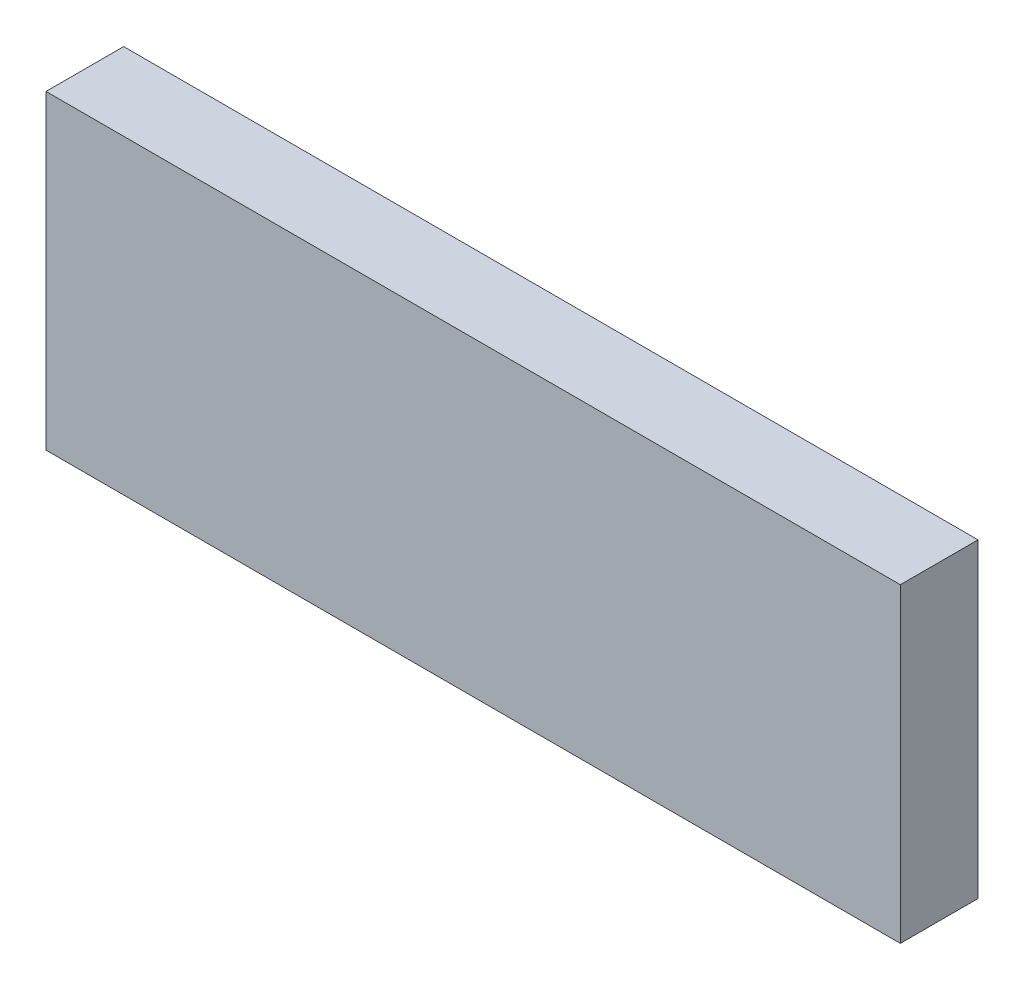
ISO-10303-21;
HEADER;
FILE_DESCRIPTION(('STEP AP214'),'2;1');
FILE_NAME('part.step','',(''),(''),'','','');
FILE_SCHEMA(('AUTOMOTIVE_DESIGN { 1 0 10303 214 1 1 1 1 }'));
ENDSEC;
DATA;
#1=APPLICATION_CONTEXT('core data for automotive mechanical design processes');
#2=APPLICATION_PROTOCOL_DEFINITION('international standard','automotive_design',2000,#1);
#3=PRODUCT_CONTEXT('',#1,'mechanical');
#4=PRODUCT('Part','Part','',(#3));
#5=PRODUCT_RELATED_PRODUCT_CATEGORY('part','',(#4));
#6=PRODUCT_DEFINITION_FORMATION('','',#4);
#7=PRODUCT_DEFINITION_CONTEXT('part definition',#1,'design');
#8=PRODUCT_DEFINITION('design','',#6,#7);
#9=PRODUCT_DEFINITION_SHAPE('','',#8);
#10=(LENGTH_UNIT() NAMED_UNIT(*) SI_UNIT(.MILLI.,.METRE.));
#11=(NAMED_UNIT(*) PLANE_ANGLE_UNIT() SI_UNIT($,.RADIAN.));
#12=(NAMED_UNIT(*) SI_UNIT($,.STERADIAN.) SOLID_ANGLE_UNIT());
#13=UNCERTAINTY_MEASURE_WITH_UNIT(LENGTH_MEASURE(1.E-05),#10,'distance_accuracy_value','');
#14=(GEOMETRIC_REPRESENTATION_CONTEXT(3) GLOBAL_UNCERTAINTY_ASSIGNED_CONTEXT((#13)) GLOBAL_UNIT_ASSIGNED_CONTEXT((#10,
#11,#12)) REPRESENTATION_CONTEXT('',''));
#15=CARTESIAN_POINT('',(0.,0.,0.));
#16=DIRECTION('',(0.,0.,1.));
#17=DIRECTION('',(1.,0.,0.));
#18=AXIS2_PLACEMENT_3D('',#15,#16,#17);
#19=CARTESIAN_POINT('',(-46.0306474820144,34.925,6.35));
#20=DIRECTION('',(1.,0.,0.));
#21=DIRECTION('',(0.,1.,0.));
#22=AXIS2_PLACEMENT_3D('',#19,#20,#21);
#23=PLANE('',#22);
#24=DIRECTION('',(0.,-1.,0.));
#25=VECTOR('',#24,1.);
#26=CARTESIAN_POINT('',(-46.0306474820144,34.925,0.));
#27=LINE('',#26,#25);
#28=CARTESIAN_POINT('',(-46.0306474820144,34.925,0.));
#29=VERTEX_POINT('',#28);
#30=CARTESIAN_POINT('',(-46.0306474820144,9.525,0.));
#31=VERTEX_POINT('',#30);
#32=EDGE_CURVE('E96',#29,#31,#27,.T.);
#33=ORIENTED_EDGE('',*,*,#32,.T.);
#34=DIRECTION('',(0.,0.,-1.));
#35=VECTOR('',#34,1.);
#36=CARTESIAN_POINT('',(-46.0306474820144,9.525,6.35));
#37=LINE('',#36,#35);
#38=CARTESIAN_POINT('',(-46.0306474820144,9.525,6.35));
#39=VERTEX_POINT('',#38);
#40=EDGE_CURVE('E11',#39,#31,#37,.T.);
#41=ORIENTED_EDGE('',*,*,#40,.F.);
#42=DIRECTION('',(0.,-1.,0.));
#43=VECTOR('',#42,1.);
#44=CARTESIAN_POINT('',(-46.0306474820144,34.925,6.35));
#45=LINE('',#44,#43);
#46=CARTESIAN_POINT('',(-46.0306474820144,34.925,6.35));
#47=VERTEX_POINT('',#46);
#48=EDGE_CURVE('E84',#47,#39,#45,.T.);
#49=ORIENTED_EDGE('',*,*,#48,.F.);
#50=DIRECTION('',(0.,0.,-1.));
#51=VECTOR('',#50,1.);
#52=CARTESIAN_POINT('',(-46.0306474820144,34.925,6.35));
#53=LINE('',#52,#51);
#54=EDGE_CURVE('E92',#47,#29,#53,.T.);
#55=ORIENTED_EDGE('',*,*,#54,.T.);
#56=EDGE_LOOP('',(#33,#41,#49,#55));
#57=FACE_BOUND('',#56,.T.);
#58=ADVANCED_FACE('F33',(#57),#23,.F.);
#59=CARTESIAN_POINT('',(-46.0306474820144,9.525,6.35));
#60=DIRECTION('',(0.,1.,0.));
#61=DIRECTION('',(0.,0.,1.));
#62=AXIS2_PLACEMENT_3D('',#59,#60,#61);
#63=PLANE('',#62);
#64=DIRECTION('',(1.,0.,0.));
#65=VECTOR('',#64,1.);
#66=CARTESIAN_POINT('',(-46.0306474820144,9.525,0.));
#67=LINE('',#66,#65);
#68=CARTESIAN_POINT('',(23.8193525179856,9.525,0.));
#69=VERTEX_POINT('',#68);
#70=EDGE_CURVE('E88',#31,#69,#67,.T.);
#71=ORIENTED_EDGE('',*,*,#70,.T.);
#72=DIRECTION('',(0.,0.,-1.));
#73=VECTOR('',#72,1.);
#74=CARTESIAN_POINT('',(23.8193525179856,9.525,6.35));
#75=LINE('',#74,#73);
#76=CARTESIAN_POINT('',(23.8193525179856,9.525,6.35));
#77=VERTEX_POINT('',#76);
#78=EDGE_CURVE('E41',#77,#69,#75,.T.);
#79=ORIENTED_EDGE('',*,*,#78,.F.);
#80=DIRECTION('',(1.,0.,0.));
#81=VECTOR('',#80,1.);
#82=CARTESIAN_POINT('',(-46.0306474820144,9.525,6.35));
#83=LINE('',#82,#81);
#84=EDGE_CURVE('E79',#39,#77,#83,.T.);
#85=ORIENTED_EDGE('',*,*,#84,.F.);
#86=ORIENTED_EDGE('',*,*,#40,.T.);
#87=EDGE_LOOP('',(#71,#79,#85,#86));
#88=FACE_BOUND('',#87,.T.);
#89=ADVANCED_FACE('F87',(#88),#63,.F.);
#90=CARTESIAN_POINT('',(23.8193525179856,34.925,6.35));
#91=DIRECTION('',(-1.,0.,0.));
#92=DIRECTION('',(0.,0.,1.));
#93=AXIS2_PLACEMENT_3D('',#90,#91,#92);
#94=PLANE('',#93);
#95=DIRECTION('',(0.,1.,0.));
#96=VECTOR('',#95,1.);
#97=CARTESIAN_POINT('',(23.8193525179856,34.925,0.));
#98=LINE('',#97,#96);
#99=CARTESIAN_POINT('',(23.8193525179856,34.925,0.));
#100=VERTEX_POINT('',#99);
#101=EDGE_CURVE('E66',#69,#100,#98,.T.);
#102=ORIENTED_EDGE('',*,*,#101,.T.);
#103=DIRECTION('',(0.,0.,-1.));
#104=VECTOR('',#103,1.);
#105=CARTESIAN_POINT('',(23.8193525179856,34.925,6.35));
#106=LINE('',#105,#104);
#107=CARTESIAN_POINT('',(23.8193525179856,34.925,6.35));
#108=VERTEX_POINT('',#107);
#109=EDGE_CURVE('E89',#108,#100,#106,.T.);
#110=ORIENTED_EDGE('',*,*,#109,.F.);
#111=DIRECTION('',(0.,1.,0.));
#112=VECTOR('',#111,1.);
#113=CARTESIAN_POINT('',(23.8193525179856,34.925,6.35));
#114=LINE('',#113,#112);
#115=EDGE_CURVE('E82',#77,#108,#114,.T.);
#116=ORIENTED_EDGE('',*,*,#115,.F.);
#117=ORIENTED_EDGE('',*,*,#78,.T.);
#118=EDGE_LOOP('',(#102,#110,#116,#117));
#119=FACE_BOUND('',#118,.T.);
#120=ADVANCED_FACE('F90',(#119),#94,.F.);
#121=CARTESIAN_POINT('',(-46.0306474820144,34.925,6.35));
#122=DIRECTION('',(0.,-1.,0.));
#123=DIRECTION('',(0.,0.,-1.));
#124=AXIS2_PLACEMENT_3D('',#121,#122,#123);
#125=PLANE('',#124);
#126=DIRECTION('',(-1.,0.,0.));
#127=VECTOR('',#126,1.);
#128=CARTESIAN_POINT('',(-46.0306474820144,34.925,0.));
#129=LINE('',#128,#127);
#130=EDGE_CURVE('E72',#100,#29,#129,.T.);
#131=ORIENTED_EDGE('',*,*,#130,.T.);
#132=ORIENTED_EDGE('',*,*,#54,.F.);
#133=DIRECTION('',(-1.,0.,0.));
#134=VECTOR('',#133,1.);
#135=CARTESIAN_POINT('',(-46.0306474820144,34.925,6.35));
#136=LINE('',#135,#134);
#137=EDGE_CURVE('E49',#108,#47,#136,.T.);
#138=ORIENTED_EDGE('',*,*,#137,.F.);
#139=ORIENTED_EDGE('',*,*,#109,.T.);
#140=EDGE_LOOP('',(#131,#132,#138,#139));
#141=FACE_BOUND('',#140,.T.);
#142=ADVANCED_FACE('F103',(#141),#125,.F.);
#143=CARTESIAN_POINT('',(0.,0.,6.35));
#144=DIRECTION('',(0.,0.,1.));
#145=DIRECTION('',(1.,0.,0.));
#146=AXIS2_PLACEMENT_3D('',#143,#144,#145);
#147=PLANE('',#146);
#148=ORIENTED_EDGE('',*,*,#48,.T.);
#149=ORIENTED_EDGE('',*,*,#84,.T.);
#150=ORIENTED_EDGE('',*,*,#115,.T.);
#151=ORIENTED_EDGE('',*,*,#137,.T.);
#152=EDGE_LOOP('',(#148,#149,#150,#151));
#153=FACE_BOUND('',#152,.T.);
#154=ADVANCED_FACE('F80',(#153),#147,.T.);
#155=CARTESIAN_POINT('',(0.,0.,0.));
#156=DIRECTION('',(0.,0.,1.));
#157=DIRECTION('',(1.,0.,0.));
#158=AXIS2_PLACEMENT_3D('',#155,#156,#157);
#159=PLANE('',#158);
#160=ORIENTED_EDGE('',*,*,#32,.F.);
#161=ORIENTED_EDGE('',*,*,#130,.F.);
#162=ORIENTED_EDGE('',*,*,#101,.F.);
#163=ORIENTED_EDGE('',*,*,#70,.F.);
#164=EDGE_LOOP('',(#160,#161,#162,#163));
#165=FACE_BOUND('',#164,.T.);
#166=ADVANCED_FACE('F106',(#165),#159,.F.);
#167=CLOSED_SHELL('',(#58,#89,#120,#142,#154,#166));
#168=MANIFOLD_SOLID_BREP('B2',#167);
#169=ADVANCED_BREP_SHAPE_REPRESENTATION('',(#18,#168),#14);
#170=SHAPE_DEFINITION_REPRESENTATION(#9,#169);
ENDSEC;
END-ISO-10303-21;
